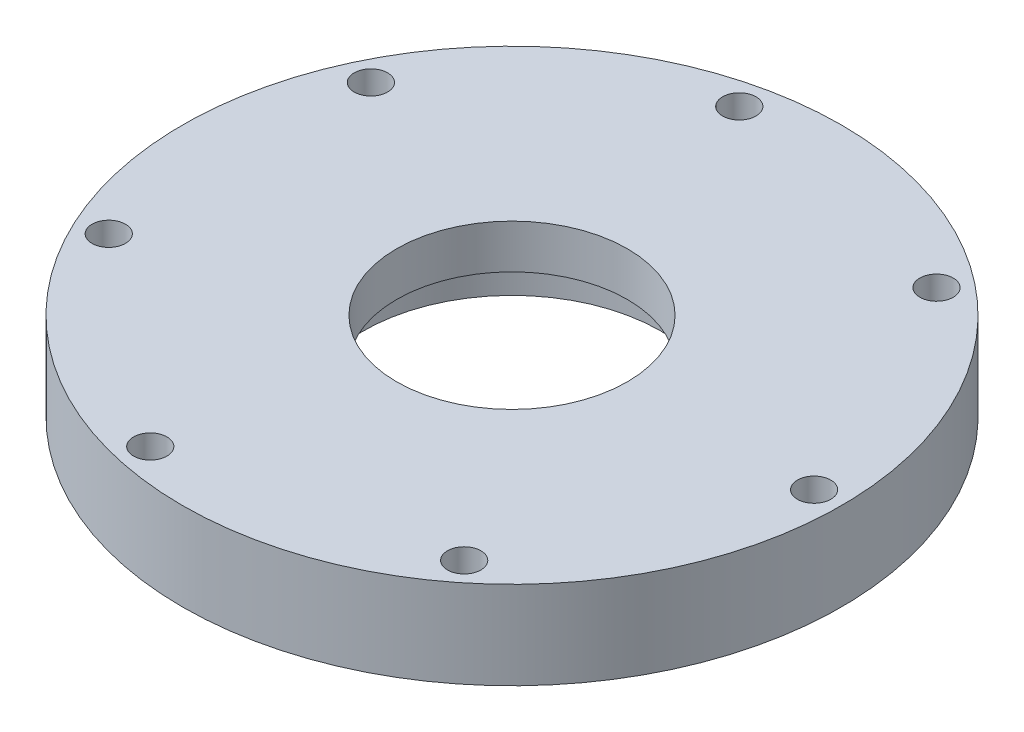
ISO-10303-21;
HEADER;
FILE_DESCRIPTION(('STEP AP214'),'2;1');
FILE_NAME('part.step','',(''),(''),'','','');
FILE_SCHEMA(('AUTOMOTIVE_DESIGN { 1 0 10303 214 1 1 1 1 }'));
ENDSEC;
DATA;
#1=APPLICATION_CONTEXT('core data for automotive mechanical design processes');
#2=APPLICATION_PROTOCOL_DEFINITION('international standard','automotive_design',2000,#1);
#3=PRODUCT_CONTEXT('',#1,'mechanical');
#4=PRODUCT('Part','Part','',(#3));
#5=PRODUCT_RELATED_PRODUCT_CATEGORY('part','',(#4));
#6=PRODUCT_DEFINITION_FORMATION('','',#4);
#7=PRODUCT_DEFINITION_CONTEXT('part definition',#1,'design');
#8=PRODUCT_DEFINITION('design','',#6,#7);
#9=PRODUCT_DEFINITION_SHAPE('','',#8);
#10=(LENGTH_UNIT() NAMED_UNIT(*) SI_UNIT(.MILLI.,.METRE.));
#11=(NAMED_UNIT(*) PLANE_ANGLE_UNIT() SI_UNIT($,.RADIAN.));
#12=(NAMED_UNIT(*) SI_UNIT($,.STERADIAN.) SOLID_ANGLE_UNIT());
#13=UNCERTAINTY_MEASURE_WITH_UNIT(LENGTH_MEASURE(1.E-05),#10,'distance_accuracy_value','');
#14=(GEOMETRIC_REPRESENTATION_CONTEXT(3) GLOBAL_UNCERTAINTY_ASSIGNED_CONTEXT((#13)) GLOBAL_UNIT_ASSIGNED_CONTEXT((#10,
#11,#12)) REPRESENTATION_CONTEXT('',''));
#15=CARTESIAN_POINT('',(0.,0.,0.));
#16=DIRECTION('',(0.,0.,1.));
#17=DIRECTION('',(1.,0.,0.));
#18=AXIS2_PLACEMENT_3D('',#15,#16,#17);
#19=CARTESIAN_POINT('',(0.,8.,0.));
#20=DIRECTION('',(0.,-1.,0.));
#21=DIRECTION('',(0.,0.,-1.));
#22=AXIS2_PLACEMENT_3D('',#19,#20,#21);
#23=CYLINDRICAL_SURFACE('',#22,10.5);
#24=CARTESIAN_POINT('',(0.,8.,0.));
#25=DIRECTION('',(0.,1.,0.));
#26=DIRECTION('',(0.,0.,1.));
#27=AXIS2_PLACEMENT_3D('',#24,#25,#26);
#28=CIRCLE('',#27,10.5);
#29=CARTESIAN_POINT('',(0.,8.,10.5));
#30=VERTEX_POINT('',#29);
#31=EDGE_CURVE('E44',#30,#30,#28,.T.);
#32=ORIENTED_EDGE('',*,*,#31,.T.);
#33=EDGE_LOOP('',(#32));
#34=FACE_BOUND('',#33,.T.);
#35=CARTESIAN_POINT('',(0.,4.,0.));
#36=DIRECTION('',(0.,-1.,0.));
#37=DIRECTION('',(0.,0.,-1.));
#38=AXIS2_PLACEMENT_3D('',#35,#36,#37);
#39=CIRCLE('',#38,10.5);
#40=CARTESIAN_POINT('',(0.,4.,-10.5));
#41=VERTEX_POINT('',#40);
#42=EDGE_CURVE('E35',#41,#41,#39,.T.);
#43=ORIENTED_EDGE('',*,*,#42,.T.);
#44=EDGE_LOOP('',(#43));
#45=FACE_BOUND('',#44,.T.);
#46=ADVANCED_FACE('F31',(#34,#45),#23,.F.);
#47=CARTESIAN_POINT('',(0.,8.,0.));
#48=DIRECTION('',(0.,1.,0.));
#49=DIRECTION('',(0.,0.,1.));
#50=AXIS2_PLACEMENT_3D('',#47,#48,#49);
#51=PLANE('',#50);
#52=CARTESIAN_POINT('',(27.5,8.,0.));
#53=DIRECTION('',(0.,1.,0.));
#54=DIRECTION('',(0.,0.,1.));
#55=AXIS2_PLACEMENT_3D('',#52,#53,#54);
#56=CIRCLE('',#55,1.52);
#57=CARTESIAN_POINT('',(27.5,8.,1.52));
#58=VERTEX_POINT('',#57);
#59=EDGE_CURVE('E91',#58,#58,#56,.T.);
#60=ORIENTED_EDGE('',*,*,#59,.F.);
#61=EDGE_LOOP('',(#60));
#62=FACE_BOUND('',#61,.T.);
#63=CARTESIAN_POINT('',(17.1459695511151,8.,21.5003657678709));
#64=DIRECTION('',(0.,1.,0.));
#65=DIRECTION('',(0.,0.,1.));
#66=AXIS2_PLACEMENT_3D('',#63,#64,#65);
#67=CIRCLE('',#66,1.52);
#68=CARTESIAN_POINT('',(17.1459695511151,8.,23.0203657678709));
#69=VERTEX_POINT('',#68);
#70=EDGE_CURVE('E85',#69,#69,#67,.T.);
#71=ORIENTED_EDGE('',*,*,#70,.F.);
#72=EDGE_LOOP('',(#71));
#73=FACE_BOUND('',#72,.T.);
#74=CARTESIAN_POINT('',(-6.11932568379875,8.,26.8105175850001));
#75=DIRECTION('',(0.,1.,0.));
#76=DIRECTION('',(0.,0.,1.));
#77=AXIS2_PLACEMENT_3D('',#74,#75,#76);
#78=CIRCLE('',#77,1.52);
#79=CARTESIAN_POINT('',(-6.11932568379875,8.,28.3305175850001));
#80=VERTEX_POINT('',#79);
#81=EDGE_CURVE('E79',#80,#80,#78,.T.);
#82=ORIENTED_EDGE('',*,*,#81,.F.);
#83=EDGE_LOOP('',(#82));
#84=FACE_BOUND('',#83,.T.);
#85=CARTESIAN_POINT('',(-24.7766438673166,8.,11.9318028257327));
#86=DIRECTION('',(0.,1.,0.));
#87=DIRECTION('',(0.,0.,1.));
#88=AXIS2_PLACEMENT_3D('',#85,#86,#87);
#89=CIRCLE('',#88,1.52);
#90=CARTESIAN_POINT('',(-24.7766438673166,8.,13.4518028257327));
#91=VERTEX_POINT('',#90);
#92=EDGE_CURVE('E73',#91,#91,#89,.T.);
#93=ORIENTED_EDGE('',*,*,#92,.F.);
#94=EDGE_LOOP('',(#93));
#95=FACE_BOUND('',#94,.T.);
#96=CARTESIAN_POINT('',(-24.7766438673164,8.,-11.931802825733));
#97=DIRECTION('',(0.,1.,0.));
#98=DIRECTION('',(0.,0.,1.));
#99=AXIS2_PLACEMENT_3D('',#96,#97,#98);
#100=CIRCLE('',#99,1.52);
#101=CARTESIAN_POINT('',(-24.7766438673164,8.,-10.411802825733));
#102=VERTEX_POINT('',#101);
#103=EDGE_CURVE('E67',#102,#102,#100,.T.);
#104=ORIENTED_EDGE('',*,*,#103,.F.);
#105=EDGE_LOOP('',(#104));
#106=FACE_BOUND('',#105,.T.);
#107=CARTESIAN_POINT('',(-6.11932568379838,8.,-26.8105175850002));
#108=DIRECTION('',(0.,1.,0.));
#109=DIRECTION('',(0.,0.,1.));
#110=AXIS2_PLACEMENT_3D('',#107,#108,#109);
#111=CIRCLE('',#110,1.52);
#112=CARTESIAN_POINT('',(-6.11932568379838,8.,-25.2905175850002));
#113=VERTEX_POINT('',#112);
#114=EDGE_CURVE('E61',#113,#113,#111,.T.);
#115=ORIENTED_EDGE('',*,*,#114,.F.);
#116=EDGE_LOOP('',(#115));
#117=FACE_BOUND('',#116,.T.);
#118=CARTESIAN_POINT('',(17.1459695511154,8.,-21.5003657678706));
#119=DIRECTION('',(0.,1.,0.));
#120=DIRECTION('',(0.,0.,1.));
#121=AXIS2_PLACEMENT_3D('',#118,#119,#120);
#122=CIRCLE('',#121,1.52);
#123=CARTESIAN_POINT('',(17.1459695511154,8.,-19.9803657678706));
#124=VERTEX_POINT('',#123);
#125=EDGE_CURVE('E55',#124,#124,#122,.T.);
#126=ORIENTED_EDGE('',*,*,#125,.F.);
#127=EDGE_LOOP('',(#126));
#128=FACE_BOUND('',#127,.T.);
#129=CARTESIAN_POINT('',(0.,8.,0.));
#130=DIRECTION('',(0.,1.,0.));
#131=DIRECTION('',(0.,0.,1.));
#132=AXIS2_PLACEMENT_3D('',#129,#130,#131);
#133=CIRCLE('',#132,30.);
#134=CARTESIAN_POINT('',(0.,8.,30.));
#135=VERTEX_POINT('',#134);
#136=EDGE_CURVE('E10',#135,#135,#133,.T.);
#137=ORIENTED_EDGE('',*,*,#136,.T.);
#138=EDGE_LOOP('',(#137));
#139=FACE_BOUND('',#138,.T.);
#140=ORIENTED_EDGE('',*,*,#31,.F.);
#141=EDGE_LOOP('',(#140));
#142=FACE_BOUND('',#141,.T.);
#143=ADVANCED_FACE('F107',(#62,#73,#84,#95,#106,#117,#128,#139,#142),#51,.T.);
#144=CARTESIAN_POINT('',(0.,0.,0.));
#145=DIRECTION('',(0.,1.,0.));
#146=DIRECTION('',(0.,0.,1.));
#147=AXIS2_PLACEMENT_3D('',#144,#145,#146);
#148=PLANE('',#147);
#149=CARTESIAN_POINT('',(27.5,0.,0.));
#150=DIRECTION('',(0.,1.,0.));
#151=DIRECTION('',(0.,0.,1.));
#152=AXIS2_PLACEMENT_3D('',#149,#150,#151);
#153=CIRCLE('',#152,1.52);
#154=CARTESIAN_POINT('',(27.5,0.,1.52));
#155=VERTEX_POINT('',#154);
#156=EDGE_CURVE('E52',#155,#155,#153,.T.);
#157=ORIENTED_EDGE('',*,*,#156,.T.);
#158=EDGE_LOOP('',(#157));
#159=FACE_BOUND('',#158,.T.);
#160=CARTESIAN_POINT('',(17.1459695511151,0.,21.5003657678709));
#161=DIRECTION('',(0.,1.,0.));
#162=DIRECTION('',(0.,0.,1.));
#163=AXIS2_PLACEMENT_3D('',#160,#161,#162);
#164=CIRCLE('',#163,1.52);
#165=CARTESIAN_POINT('',(17.1459695511151,0.,23.0203657678709));
#166=VERTEX_POINT('',#165);
#167=EDGE_CURVE('E88',#166,#166,#164,.T.);
#168=ORIENTED_EDGE('',*,*,#167,.T.);
#169=EDGE_LOOP('',(#168));
#170=FACE_BOUND('',#169,.T.);
#171=CARTESIAN_POINT('',(-6.11932568379875,0.,26.8105175850001));
#172=DIRECTION('',(0.,1.,0.));
#173=DIRECTION('',(0.,0.,1.));
#174=AXIS2_PLACEMENT_3D('',#171,#172,#173);
#175=CIRCLE('',#174,1.52);
#176=CARTESIAN_POINT('',(-6.11932568379875,0.,28.3305175850001));
#177=VERTEX_POINT('',#176);
#178=EDGE_CURVE('E82',#177,#177,#175,.T.);
#179=ORIENTED_EDGE('',*,*,#178,.T.);
#180=EDGE_LOOP('',(#179));
#181=FACE_BOUND('',#180,.T.);
#182=CARTESIAN_POINT('',(-24.7766438673166,0.,11.9318028257327));
#183=DIRECTION('',(0.,1.,0.));
#184=DIRECTION('',(0.,0.,1.));
#185=AXIS2_PLACEMENT_3D('',#182,#183,#184);
#186=CIRCLE('',#185,1.52);
#187=CARTESIAN_POINT('',(-24.7766438673166,0.,13.4518028257327));
#188=VERTEX_POINT('',#187);
#189=EDGE_CURVE('E76',#188,#188,#186,.T.);
#190=ORIENTED_EDGE('',*,*,#189,.T.);
#191=EDGE_LOOP('',(#190));
#192=FACE_BOUND('',#191,.T.);
#193=CARTESIAN_POINT('',(-24.7766438673164,0.,-11.931802825733));
#194=DIRECTION('',(0.,1.,0.));
#195=DIRECTION('',(0.,0.,1.));
#196=AXIS2_PLACEMENT_3D('',#193,#194,#195);
#197=CIRCLE('',#196,1.52);
#198=CARTESIAN_POINT('',(-24.7766438673164,0.,-10.411802825733));
#199=VERTEX_POINT('',#198);
#200=EDGE_CURVE('E70',#199,#199,#197,.T.);
#201=ORIENTED_EDGE('',*,*,#200,.T.);
#202=EDGE_LOOP('',(#201));
#203=FACE_BOUND('',#202,.T.);
#204=CARTESIAN_POINT('',(-6.11932568379838,0.,-26.8105175850002));
#205=DIRECTION('',(0.,1.,0.));
#206=DIRECTION('',(0.,0.,1.));
#207=AXIS2_PLACEMENT_3D('',#204,#205,#206);
#208=CIRCLE('',#207,1.52);
#209=CARTESIAN_POINT('',(-6.11932568379838,0.,-25.2905175850002));
#210=VERTEX_POINT('',#209);
#211=EDGE_CURVE('E64',#210,#210,#208,.T.);
#212=ORIENTED_EDGE('',*,*,#211,.T.);
#213=EDGE_LOOP('',(#212));
#214=FACE_BOUND('',#213,.T.);
#215=CARTESIAN_POINT('',(17.1459695511154,0.,-21.5003657678706));
#216=DIRECTION('',(0.,1.,0.));
#217=DIRECTION('',(0.,0.,1.));
#218=AXIS2_PLACEMENT_3D('',#215,#216,#217);
#219=CIRCLE('',#218,1.52);
#220=CARTESIAN_POINT('',(17.1459695511154,0.,-19.9803657678706));
#221=VERTEX_POINT('',#220);
#222=EDGE_CURVE('E58',#221,#221,#219,.T.);
#223=ORIENTED_EDGE('',*,*,#222,.T.);
#224=EDGE_LOOP('',(#223));
#225=FACE_BOUND('',#224,.T.);
#226=CARTESIAN_POINT('',(0.,0.,0.));
#227=DIRECTION('',(0.,-1.,0.));
#228=DIRECTION('',(0.,0.,-1.));
#229=AXIS2_PLACEMENT_3D('',#226,#227,#228);
#230=CIRCLE('',#229,13.53);
#231=CARTESIAN_POINT('',(0.,0.,-13.53));
#232=VERTEX_POINT('',#231);
#233=EDGE_CURVE('E48',#232,#232,#230,.T.);
#234=ORIENTED_EDGE('',*,*,#233,.F.);
#235=EDGE_LOOP('',(#234));
#236=FACE_BOUND('',#235,.T.);
#237=CARTESIAN_POINT('',(0.,0.,0.));
#238=DIRECTION('',(0.,1.,0.));
#239=DIRECTION('',(0.,0.,1.));
#240=AXIS2_PLACEMENT_3D('',#237,#238,#239);
#241=CIRCLE('',#240,30.);
#242=CARTESIAN_POINT('',(0.,0.,30.));
#243=VERTEX_POINT('',#242);
#244=EDGE_CURVE('E39',#243,#243,#241,.T.);
#245=ORIENTED_EDGE('',*,*,#244,.F.);
#246=EDGE_LOOP('',(#245));
#247=FACE_BOUND('',#246,.T.);
#248=ADVANCED_FACE('F97',(#159,#170,#181,#192,#203,#214,#225,#236,#247),#148,.F.);
#249=CARTESIAN_POINT('',(0.,8.,0.));
#250=DIRECTION('',(0.,-1.,0.));
#251=DIRECTION('',(0.,0.,-1.));
#252=AXIS2_PLACEMENT_3D('',#249,#250,#251);
#253=CYLINDRICAL_SURFACE('',#252,30.);
#254=ORIENTED_EDGE('',*,*,#136,.F.);
#255=EDGE_LOOP('',(#254));
#256=FACE_BOUND('',#255,.T.);
#257=ORIENTED_EDGE('',*,*,#244,.T.);
#258=EDGE_LOOP('',(#257));
#259=FACE_BOUND('',#258,.T.);
#260=ADVANCED_FACE('F33',(#256,#259),#253,.T.);
#261=CARTESIAN_POINT('',(0.,4.,0.));
#262=DIRECTION('',(0.,-1.,0.));
#263=DIRECTION('',(0.,0.,-1.));
#264=AXIS2_PLACEMENT_3D('',#261,#262,#263);
#265=CYLINDRICAL_SURFACE('',#264,13.53);
#266=CARTESIAN_POINT('',(0.,4.,0.));
#267=DIRECTION('',(0.,-1.,0.));
#268=DIRECTION('',(0.,0.,-1.));
#269=AXIS2_PLACEMENT_3D('',#266,#267,#268);
#270=CIRCLE('',#269,13.53);
#271=CARTESIAN_POINT('',(0.,4.,-13.53));
#272=VERTEX_POINT('',#271);
#273=EDGE_CURVE('E51',#272,#272,#270,.T.);
#274=ORIENTED_EDGE('',*,*,#273,.F.);
#275=EDGE_LOOP('',(#274));
#276=FACE_BOUND('',#275,.T.);
#277=ORIENTED_EDGE('',*,*,#233,.T.);
#278=EDGE_LOOP('',(#277));
#279=FACE_BOUND('',#278,.T.);
#280=ADVANCED_FACE('F135',(#276,#279),#265,.F.);
#281=CARTESIAN_POINT('',(0.,4.,0.));
#282=DIRECTION('',(0.,-1.,0.));
#283=DIRECTION('',(0.,0.,-1.));
#284=AXIS2_PLACEMENT_3D('',#281,#282,#283);
#285=PLANE('',#284);
#286=ORIENTED_EDGE('',*,*,#42,.F.);
#287=EDGE_LOOP('',(#286));
#288=FACE_BOUND('',#287,.T.);
#289=ORIENTED_EDGE('',*,*,#273,.T.);
#290=EDGE_LOOP('',(#289));
#291=FACE_BOUND('',#290,.T.);
#292=ADVANCED_FACE('F131',(#288,#291),#285,.T.);
#293=CARTESIAN_POINT('',(17.1459695511154,0.,-21.5003657678706));
#294=DIRECTION('',(0.,1.,0.));
#295=DIRECTION('',(0.,0.,1.));
#296=AXIS2_PLACEMENT_3D('',#293,#294,#295);
#297=CYLINDRICAL_SURFACE('',#296,1.52);
#298=ORIENTED_EDGE('',*,*,#222,.F.);
#299=EDGE_LOOP('',(#298));
#300=FACE_BOUND('',#299,.T.);
#301=ORIENTED_EDGE('',*,*,#125,.T.);
#302=EDGE_LOOP('',(#301));
#303=FACE_BOUND('',#302,.T.);
#304=ADVANCED_FACE('F134',(#300,#303),#297,.F.);
#305=CARTESIAN_POINT('',(-6.11932568379838,0.,-26.8105175850002));
#306=DIRECTION('',(0.,1.,0.));
#307=DIRECTION('',(0.,0.,1.));
#308=AXIS2_PLACEMENT_3D('',#305,#306,#307);
#309=CYLINDRICAL_SURFACE('',#308,1.52);
#310=ORIENTED_EDGE('',*,*,#211,.F.);
#311=EDGE_LOOP('',(#310));
#312=FACE_BOUND('',#311,.T.);
#313=ORIENTED_EDGE('',*,*,#114,.T.);
#314=EDGE_LOOP('',(#313));
#315=FACE_BOUND('',#314,.T.);
#316=ADVANCED_FACE('F170',(#312,#315),#309,.F.);
#317=CARTESIAN_POINT('',(-24.7766438673164,0.,-11.931802825733));
#318=DIRECTION('',(0.,1.,0.));
#319=DIRECTION('',(0.,0.,1.));
#320=AXIS2_PLACEMENT_3D('',#317,#318,#319);
#321=CYLINDRICAL_SURFACE('',#320,1.52);
#322=ORIENTED_EDGE('',*,*,#200,.F.);
#323=EDGE_LOOP('',(#322));
#324=FACE_BOUND('',#323,.T.);
#325=ORIENTED_EDGE('',*,*,#103,.T.);
#326=EDGE_LOOP('',(#325));
#327=FACE_BOUND('',#326,.T.);
#328=ADVANCED_FACE('F178',(#324,#327),#321,.F.);
#329=CARTESIAN_POINT('',(-24.7766438673166,0.,11.9318028257327));
#330=DIRECTION('',(0.,1.,0.));
#331=DIRECTION('',(0.,0.,1.));
#332=AXIS2_PLACEMENT_3D('',#329,#330,#331);
#333=CYLINDRICAL_SURFACE('',#332,1.52);
#334=ORIENTED_EDGE('',*,*,#189,.F.);
#335=EDGE_LOOP('',(#334));
#336=FACE_BOUND('',#335,.T.);
#337=ORIENTED_EDGE('',*,*,#92,.T.);
#338=EDGE_LOOP('',(#337));
#339=FACE_BOUND('',#338,.T.);
#340=ADVANCED_FACE('F186',(#336,#339),#333,.F.);
#341=CARTESIAN_POINT('',(-6.11932568379875,0.,26.8105175850001));
#342=DIRECTION('',(0.,1.,0.));
#343=DIRECTION('',(0.,0.,1.));
#344=AXIS2_PLACEMENT_3D('',#341,#342,#343);
#345=CYLINDRICAL_SURFACE('',#344,1.52);
#346=ORIENTED_EDGE('',*,*,#178,.F.);
#347=EDGE_LOOP('',(#346));
#348=FACE_BOUND('',#347,.T.);
#349=ORIENTED_EDGE('',*,*,#81,.T.);
#350=EDGE_LOOP('',(#349));
#351=FACE_BOUND('',#350,.T.);
#352=ADVANCED_FACE('F194',(#348,#351),#345,.F.);
#353=CARTESIAN_POINT('',(17.1459695511151,0.,21.5003657678709));
#354=DIRECTION('',(0.,1.,0.));
#355=DIRECTION('',(0.,0.,1.));
#356=AXIS2_PLACEMENT_3D('',#353,#354,#355);
#357=CYLINDRICAL_SURFACE('',#356,1.52);
#358=ORIENTED_EDGE('',*,*,#167,.F.);
#359=EDGE_LOOP('',(#358));
#360=FACE_BOUND('',#359,.T.);
#361=ORIENTED_EDGE('',*,*,#70,.T.);
#362=EDGE_LOOP('',(#361));
#363=FACE_BOUND('',#362,.T.);
#364=ADVANCED_FACE('F103',(#360,#363),#357,.F.);
#365=CARTESIAN_POINT('',(27.5,0.,0.));
#366=DIRECTION('',(0.,1.,0.));
#367=DIRECTION('',(0.,0.,1.));
#368=AXIS2_PLACEMENT_3D('',#365,#366,#367);
#369=CYLINDRICAL_SURFACE('',#368,1.52);
#370=ORIENTED_EDGE('',*,*,#156,.F.);
#371=EDGE_LOOP('',(#370));
#372=FACE_BOUND('',#371,.T.);
#373=ORIENTED_EDGE('',*,*,#59,.T.);
#374=EDGE_LOOP('',(#373));
#375=FACE_BOUND('',#374,.T.);
#376=ADVANCED_FACE('F100',(#372,#375),#369,.F.);
#377=CLOSED_SHELL('',(#46,#143,#248,#260,#280,#292,#304,#316,#328,#340,#352,#364,#376));
#378=MANIFOLD_SOLID_BREP('B2',#377);
#379=ADVANCED_BREP_SHAPE_REPRESENTATION('',(#18,#378),#14);
#380=SHAPE_DEFINITION_REPRESENTATION(#9,#379);
ENDSEC;
END-ISO-10303-21;
